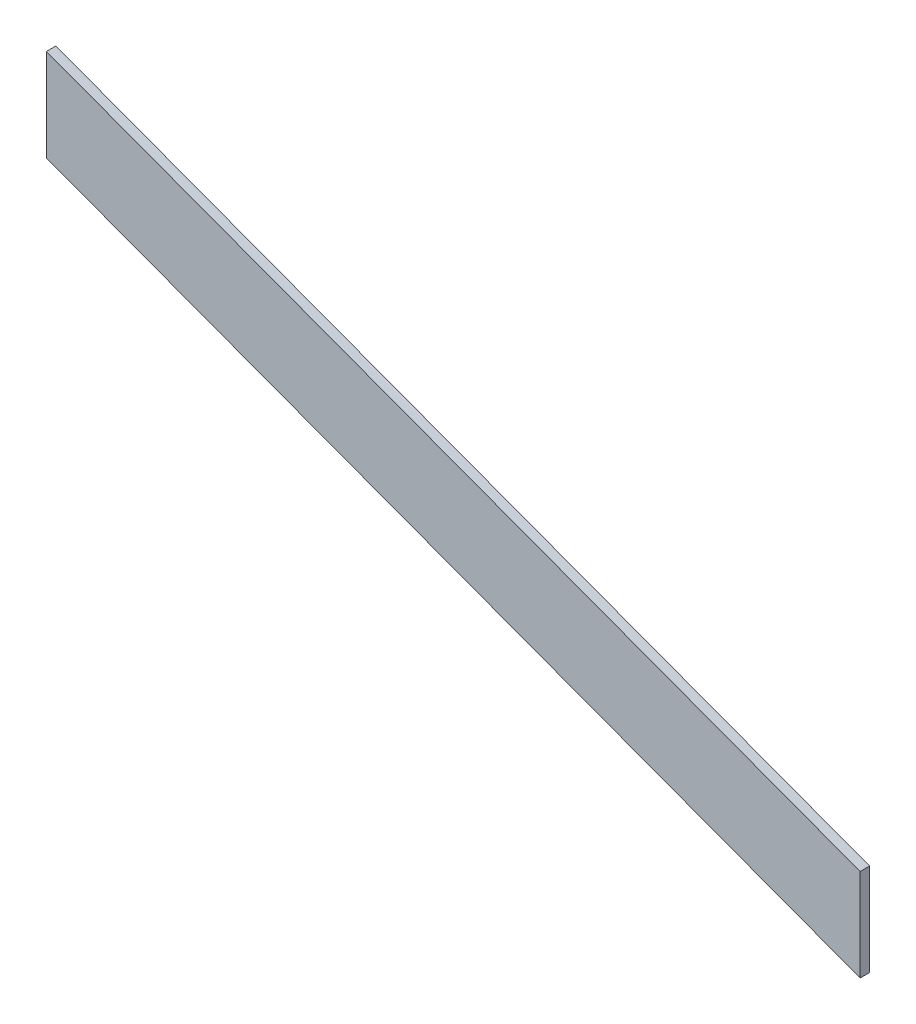
ISO-10303-21;
HEADER;
FILE_DESCRIPTION(('STEP AP214'),'2;1');
FILE_NAME('part.step','',(''),(''),'','','');
FILE_SCHEMA(('AUTOMOTIVE_DESIGN { 1 0 10303 214 1 1 1 1 }'));
ENDSEC;
DATA;
#1=APPLICATION_CONTEXT('core data for automotive mechanical design processes');
#2=APPLICATION_PROTOCOL_DEFINITION('international standard','automotive_design',2000,#1);
#3=PRODUCT_CONTEXT('',#1,'mechanical');
#4=PRODUCT('Part','Part','',(#3));
#5=PRODUCT_RELATED_PRODUCT_CATEGORY('part','',(#4));
#6=PRODUCT_DEFINITION_FORMATION('','',#4);
#7=PRODUCT_DEFINITION_CONTEXT('part definition',#1,'design');
#8=PRODUCT_DEFINITION('design','',#6,#7);
#9=PRODUCT_DEFINITION_SHAPE('','',#8);
#10=(LENGTH_UNIT() NAMED_UNIT(*) SI_UNIT(.MILLI.,.METRE.));
#11=(NAMED_UNIT(*) PLANE_ANGLE_UNIT() SI_UNIT($,.RADIAN.));
#12=(NAMED_UNIT(*) SI_UNIT($,.STERADIAN.) SOLID_ANGLE_UNIT());
#13=UNCERTAINTY_MEASURE_WITH_UNIT(LENGTH_MEASURE(1.E-05),#10,'distance_accuracy_value','');
#14=(GEOMETRIC_REPRESENTATION_CONTEXT(3) GLOBAL_UNCERTAINTY_ASSIGNED_CONTEXT((#13)) GLOBAL_UNIT_ASSIGNED_CONTEXT((#10,
#11,#12)) REPRESENTATION_CONTEXT('',''));
#15=CARTESIAN_POINT('',(0.,0.,0.));
#16=DIRECTION('',(0.,0.,1.));
#17=DIRECTION('',(1.,0.,0.));
#18=AXIS2_PLACEMENT_3D('',#15,#16,#17);
#19=CARTESIAN_POINT('',(32.574920494297,13.734089114766,2.64));
#20=DIRECTION('',(0.,0.,1.));
#21=DIRECTION('',(1.,0.,0.));
#22=AXIS2_PLACEMENT_3D('',#19,#20,#21);
#23=PLANE('',#22);
#24=DIRECTION('',(0.,1.,0.));
#25=VECTOR('',#24,1.);
#26=CARTESIAN_POINT('',(32.394920491568,17.38139745737,2.64));
#27=LINE('',#26,#25);
#28=CARTESIAN_POINT('',(32.394920491568,17.332475530047,2.64));
#29=VERTEX_POINT('',#28);
#30=CARTESIAN_POINT('',(32.3949204915681,17.4303193846922,2.64));
#31=VERTEX_POINT('',#30);
#32=EDGE_CURVE('E80',#29,#31,#27,.T.);
#33=ORIENTED_EDGE('',*,*,#32,.T.);
#34=DIRECTION('',(0.937026851005934,-0.349257327043976,0.));
#35=VECTOR('',#34,1.);
#36=CARTESIAN_POINT('',(32.826434557084,17.269481465329,2.64));
#37=LINE('',#36,#35);
#38=CARTESIAN_POINT('',(33.257948622599,17.1086435459651,2.64));
#39=VERTEX_POINT('',#38);
#40=EDGE_CURVE('E55',#31,#39,#37,.T.);
#41=ORIENTED_EDGE('',*,*,#40,.T.);
#42=DIRECTION('',(0.,1.,0.));
#43=VECTOR('',#42,1.);
#44=CARTESIAN_POINT('',(33.257948622599,17.059721618642,2.64));
#45=LINE('',#44,#43);
#46=CARTESIAN_POINT('',(33.257948622599,17.0107996913199,2.64));
#47=VERTEX_POINT('',#46);
#48=EDGE_CURVE('E57',#39,#47,#45,.F.);
#49=ORIENTED_EDGE('',*,*,#48,.T.);
#50=DIRECTION('',(-0.937026851005934,0.349257327043976,0.));
#51=VECTOR('',#50,1.);
#52=CARTESIAN_POINT('',(32.826434557084,17.171637610683,2.64));
#53=LINE('',#52,#51);
#54=EDGE_CURVE('E20',#47,#29,#53,.T.);
#55=ORIENTED_EDGE('',*,*,#54,.T.);
#56=EDGE_LOOP('',(#33,#41,#49,#55));
#57=FACE_BOUND('',#56,.T.);
#58=ADVANCED_FACE('F17',(#57),#23,.F.);
#59=CARTESIAN_POINT('',(32.826434557084,17.171637610683,2.64));
#60=DIRECTION('',(0.349257327043976,0.937026851005934,0.));
#61=DIRECTION('',(-0.937026851005934,0.349257327043976,0.));
#62=AXIS2_PLACEMENT_3D('',#59,#60,#61);
#63=PLANE('',#62);
#64=DIRECTION('',(0.,0.,-1.));
#65=VECTOR('',#64,1.);
#66=CARTESIAN_POINT('',(32.394920491568,17.332475530047,2.64));
#67=LINE('',#66,#65);
#68=CARTESIAN_POINT('',(32.394920491568,17.332475530047,2.65));
#69=VERTEX_POINT('',#68);
#70=EDGE_CURVE('E68',#69,#29,#67,.T.);
#71=ORIENTED_EDGE('',*,*,#70,.T.);
#72=ORIENTED_EDGE('',*,*,#54,.F.);
#73=DIRECTION('',(0.,0.,1.));
#74=VECTOR('',#73,1.);
#75=CARTESIAN_POINT('',(33.257948622599,17.01079969132,2.64));
#76=LINE('',#75,#74);
#77=CARTESIAN_POINT('',(33.2579486225989,17.0107996913197,2.65));
#78=VERTEX_POINT('',#77);
#79=EDGE_CURVE('E63',#47,#78,#76,.T.);
#80=ORIENTED_EDGE('',*,*,#79,.T.);
#81=DIRECTION('',(0.937026851006158,-0.349257327043375,0.));
#82=VECTOR('',#81,1.);
#83=CARTESIAN_POINT('',(32.394920491568,17.332475530047,2.65));
#84=LINE('',#83,#82);
#85=EDGE_CURVE('E83',#69,#78,#84,.T.);
#86=ORIENTED_EDGE('',*,*,#85,.F.);
#87=EDGE_LOOP('',(#71,#72,#80,#86));
#88=FACE_BOUND('',#87,.T.);
#89=ADVANCED_FACE('F65',(#88),#63,.F.);
#90=CARTESIAN_POINT('',(33.257948622599,17.059721618642,2.64));
#91=DIRECTION('',(-1.,0.,0.));
#92=DIRECTION('',(0.,0.,1.));
#93=AXIS2_PLACEMENT_3D('',#90,#91,#92);
#94=PLANE('',#93);
#95=ORIENTED_EDGE('',*,*,#79,.F.);
#96=ORIENTED_EDGE('',*,*,#48,.F.);
#97=DIRECTION('',(0.,0.,1.));
#98=VECTOR('',#97,1.);
#99=CARTESIAN_POINT('',(33.2579486225991,17.1086435459653,2.64));
#100=LINE('',#99,#98);
#101=CARTESIAN_POINT('',(33.257948622599,17.1086435459651,2.65));
#102=VERTEX_POINT('',#101);
#103=EDGE_CURVE('E75',#39,#102,#100,.T.);
#104=ORIENTED_EDGE('',*,*,#103,.T.);
#105=DIRECTION('',(0.,1.,0.));
#106=VECTOR('',#105,1.);
#107=CARTESIAN_POINT('',(33.257948622599,13.734089114766,2.65));
#108=LINE('',#107,#106);
#109=EDGE_CURVE('E72',#78,#102,#108,.T.);
#110=ORIENTED_EDGE('',*,*,#109,.F.);
#111=EDGE_LOOP('',(#95,#96,#104,#110));
#112=FACE_BOUND('',#111,.T.);
#113=ADVANCED_FACE('F70',(#112),#94,.F.);
#114=CARTESIAN_POINT('',(32.826434557084,17.269481465329,2.64));
#115=DIRECTION('',(-0.349257327043976,-0.937026851005934,0.));
#116=DIRECTION('',(0.937026851005934,-0.349257327043976,0.));
#117=AXIS2_PLACEMENT_3D('',#114,#115,#116);
#118=PLANE('',#117);
#119=ORIENTED_EDGE('',*,*,#103,.F.);
#120=ORIENTED_EDGE('',*,*,#40,.F.);
#121=DIRECTION('',(0.,0.,-1.));
#122=VECTOR('',#121,1.);
#123=CARTESIAN_POINT('',(32.394920491568,17.430319384692,2.64));
#124=LINE('',#123,#122);
#125=CARTESIAN_POINT('',(32.3949204915682,17.4303193846924,2.65));
#126=VERTEX_POINT('',#125);
#127=EDGE_CURVE('E35',#31,#126,#124,.F.);
#128=ORIENTED_EDGE('',*,*,#127,.T.);
#129=DIRECTION('',(-0.937026851006157,0.349257327043379,0.));
#130=VECTOR('',#129,1.);
#131=CARTESIAN_POINT('',(33.257948622599,17.108643545965,2.65));
#132=LINE('',#131,#130);
#133=EDGE_CURVE('E26',#102,#126,#132,.T.);
#134=ORIENTED_EDGE('',*,*,#133,.F.);
#135=EDGE_LOOP('',(#119,#120,#128,#134));
#136=FACE_BOUND('',#135,.T.);
#137=ADVANCED_FACE('F89',(#136),#118,.F.);
#138=CARTESIAN_POINT('',(32.394920491568,17.38139745737,2.64));
#139=DIRECTION('',(1.,0.,0.));
#140=DIRECTION('',(0.,0.,-1.));
#141=AXIS2_PLACEMENT_3D('',#138,#139,#140);
#142=PLANE('',#141);
#143=ORIENTED_EDGE('',*,*,#127,.F.);
#144=ORIENTED_EDGE('',*,*,#32,.F.);
#145=ORIENTED_EDGE('',*,*,#70,.F.);
#146=DIRECTION('',(0.,1.,0.));
#147=VECTOR('',#146,1.);
#148=CARTESIAN_POINT('',(32.394920491568,13.734089114766,2.65));
#149=LINE('',#148,#147);
#150=EDGE_CURVE('E11',#126,#69,#149,.F.);
#151=ORIENTED_EDGE('',*,*,#150,.F.);
#152=EDGE_LOOP('',(#143,#144,#145,#151));
#153=FACE_BOUND('',#152,.T.);
#154=ADVANCED_FACE('F91',(#153),#142,.F.);
#155=CARTESIAN_POINT('',(32.574920494297,13.734089114766,2.65));
#156=DIRECTION('',(0.,0.,1.));
#157=DIRECTION('',(1.,0.,0.));
#158=AXIS2_PLACEMENT_3D('',#155,#156,#157);
#159=PLANE('',#158);
#160=ORIENTED_EDGE('',*,*,#133,.T.);
#161=ORIENTED_EDGE('',*,*,#150,.T.);
#162=ORIENTED_EDGE('',*,*,#85,.T.);
#163=ORIENTED_EDGE('',*,*,#109,.T.);
#164=EDGE_LOOP('',(#160,#161,#162,#163));
#165=FACE_BOUND('',#164,.T.);
#166=ADVANCED_FACE('F88',(#165),#159,.T.);
#167=CLOSED_SHELL('',(#58,#89,#113,#137,#154,#166));
#168=MANIFOLD_SOLID_BREP('B1',#167);
#169=ADVANCED_BREP_SHAPE_REPRESENTATION('',(#18,#168),#14);
#170=SHAPE_DEFINITION_REPRESENTATION(#9,#169);
ENDSEC;
END-ISO-10303-21;
